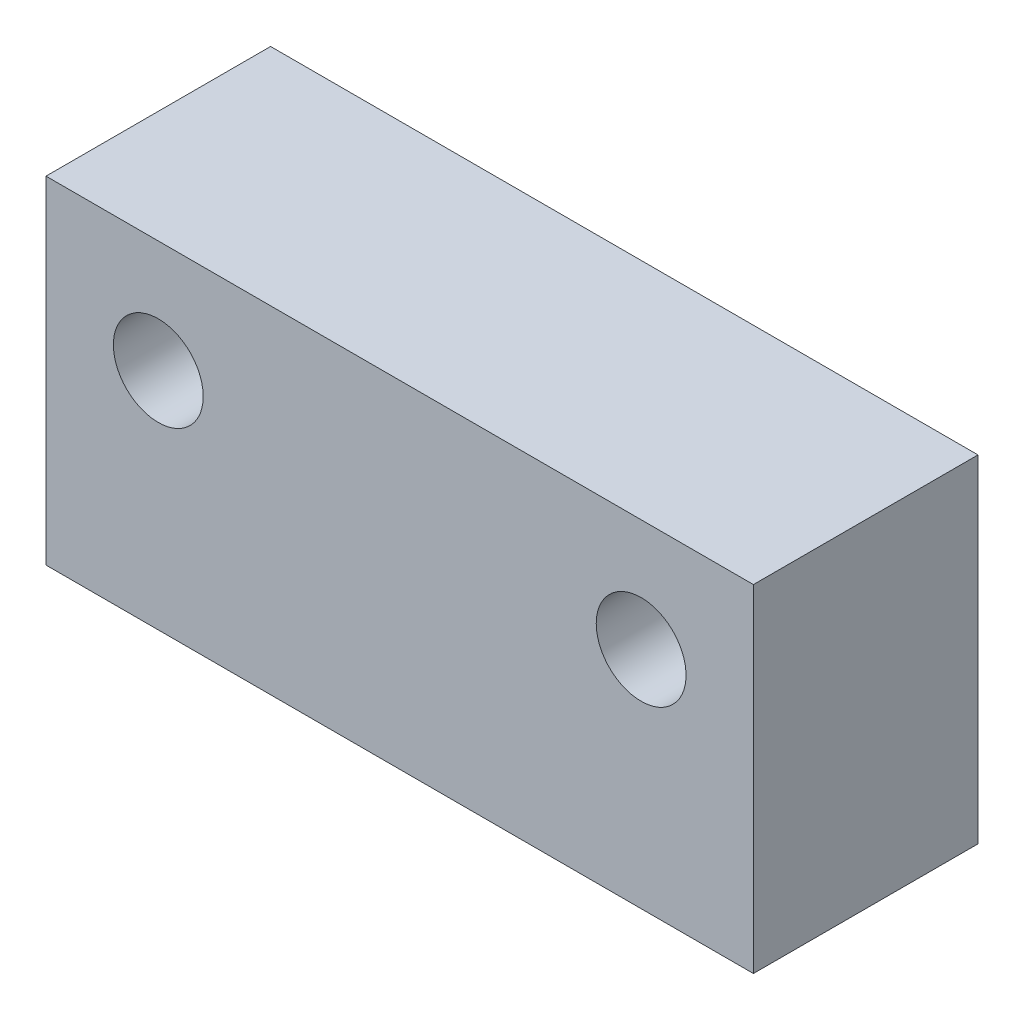
ISO-10303-21;
HEADER;
FILE_DESCRIPTION(('STEP AP214'),'2;1');
FILE_NAME('part.step','',(''),(''),'','','');
FILE_SCHEMA(('AUTOMOTIVE_DESIGN { 1 0 10303 214 1 1 1 1 }'));
ENDSEC;
DATA;
#1=APPLICATION_CONTEXT('core data for automotive mechanical design processes');
#2=APPLICATION_PROTOCOL_DEFINITION('international standard','automotive_design',2000,#1);
#3=PRODUCT_CONTEXT('',#1,'mechanical');
#4=PRODUCT('Part','Part','',(#3));
#5=PRODUCT_RELATED_PRODUCT_CATEGORY('part','',(#4));
#6=PRODUCT_DEFINITION_FORMATION('','',#4);
#7=PRODUCT_DEFINITION_CONTEXT('part definition',#1,'design');
#8=PRODUCT_DEFINITION('design','',#6,#7);
#9=PRODUCT_DEFINITION_SHAPE('','',#8);
#10=(LENGTH_UNIT() NAMED_UNIT(*) SI_UNIT(.MILLI.,.METRE.));
#11=(NAMED_UNIT(*) PLANE_ANGLE_UNIT() SI_UNIT($,.RADIAN.));
#12=(NAMED_UNIT(*) SI_UNIT($,.STERADIAN.) SOLID_ANGLE_UNIT());
#13=UNCERTAINTY_MEASURE_WITH_UNIT(LENGTH_MEASURE(1.E-05),#10,'distance_accuracy_value','');
#14=(GEOMETRIC_REPRESENTATION_CONTEXT(3) GLOBAL_UNCERTAINTY_ASSIGNED_CONTEXT((#13)) GLOBAL_UNIT_ASSIGNED_CONTEXT((#10,
#11,#12)) REPRESENTATION_CONTEXT('',''));
#15=CARTESIAN_POINT('',(0.,0.,0.));
#16=DIRECTION('',(0.,0.,1.));
#17=DIRECTION('',(1.,0.,0.));
#18=AXIS2_PLACEMENT_3D('',#15,#16,#17);
#19=CARTESIAN_POINT('',(0.,0.,20.));
#20=DIRECTION('',(0.,0.,-1.));
#21=DIRECTION('',(-1.,0.,0.));
#22=AXIS2_PLACEMENT_3D('',#19,#20,#21);
#23=PLANE('',#22);
#24=DIRECTION('',(0.,-1.,0.));
#25=VECTOR('',#24,1.);
#26=CARTESIAN_POINT('',(0.,0.,20.));
#27=LINE('',#26,#25);
#28=CARTESIAN_POINT('',(0.,30.,20.));
#29=VERTEX_POINT('',#28);
#30=CARTESIAN_POINT('',(0.,0.,20.));
#31=VERTEX_POINT('',#30);
#32=EDGE_CURVE('E86',#29,#31,#27,.T.);
#33=ORIENTED_EDGE('',*,*,#32,.T.);
#34=DIRECTION('',(1.,0.,0.));
#35=VECTOR('',#34,1.);
#36=CARTESIAN_POINT('',(0.,0.,20.));
#37=LINE('',#36,#35);
#38=CARTESIAN_POINT('',(63.,0.,20.));
#39=VERTEX_POINT('',#38);
#40=EDGE_CURVE('E81',#31,#39,#37,.T.);
#41=ORIENTED_EDGE('',*,*,#40,.T.);
#42=DIRECTION('',(0.,1.,0.));
#43=VECTOR('',#42,1.);
#44=CARTESIAN_POINT('',(63.,0.,20.));
#45=LINE('',#44,#43);
#46=CARTESIAN_POINT('',(63.,30.,20.));
#47=VERTEX_POINT('',#46);
#48=EDGE_CURVE('E84',#39,#47,#45,.T.);
#49=ORIENTED_EDGE('',*,*,#48,.T.);
#50=DIRECTION('',(-1.,0.,0.));
#51=VECTOR('',#50,1.);
#52=CARTESIAN_POINT('',(0.,30.,20.));
#53=LINE('',#52,#51);
#54=EDGE_CURVE('E51',#47,#29,#53,.T.);
#55=ORIENTED_EDGE('',*,*,#54,.T.);
#56=EDGE_LOOP('',(#33,#41,#49,#55));
#57=FACE_BOUND('',#56,.T.);
#58=CARTESIAN_POINT('',(10.,20.,20.));
#59=DIRECTION('',(0.,0.,1.));
#60=DIRECTION('',(1.,0.,0.));
#61=AXIS2_PLACEMENT_3D('',#58,#59,#60);
#62=CIRCLE('',#61,4.);
#63=CARTESIAN_POINT('',(14.,20.,20.));
#64=VERTEX_POINT('',#63);
#65=EDGE_CURVE('E101',#64,#64,#62,.T.);
#66=ORIENTED_EDGE('',*,*,#65,.F.);
#67=EDGE_LOOP('',(#66));
#68=FACE_BOUND('',#67,.T.);
#69=CARTESIAN_POINT('',(53.,20.,20.));
#70=DIRECTION('',(0.,0.,1.));
#71=DIRECTION('',(-1.,0.,0.));
#72=AXIS2_PLACEMENT_3D('',#69,#70,#71);
#73=CIRCLE('',#72,4.);
#74=CARTESIAN_POINT('',(49.,20.,20.));
#75=VERTEX_POINT('',#74);
#76=EDGE_CURVE('E116',#75,#75,#73,.T.);
#77=ORIENTED_EDGE('',*,*,#76,.F.);
#78=EDGE_LOOP('',(#77));
#79=FACE_BOUND('',#78,.T.);
#80=ADVANCED_FACE('F34',(#57,#68,#79),#23,.F.);
#81=CARTESIAN_POINT('',(0.,0.,0.));
#82=DIRECTION('',(0.,0.,-1.));
#83=DIRECTION('',(-1.,0.,0.));
#84=AXIS2_PLACEMENT_3D('',#81,#82,#83);
#85=PLANE('',#84);
#86=CARTESIAN_POINT('',(10.,20.,0.));
#87=DIRECTION('',(0.,0.,1.));
#88=DIRECTION('',(1.,0.,0.));
#89=AXIS2_PLACEMENT_3D('',#86,#87,#88);
#90=CIRCLE('',#89,4.);
#91=CARTESIAN_POINT('',(14.,20.,0.));
#92=VERTEX_POINT('',#91);
#93=EDGE_CURVE('E113',#92,#92,#90,.T.);
#94=ORIENTED_EDGE('',*,*,#93,.T.);
#95=EDGE_LOOP('',(#94));
#96=FACE_BOUND('',#95,.T.);
#97=DIRECTION('',(0.,-1.,0.));
#98=VECTOR('',#97,1.);
#99=CARTESIAN_POINT('',(0.,0.,0.));
#100=LINE('',#99,#98);
#101=CARTESIAN_POINT('',(0.,30.,0.));
#102=VERTEX_POINT('',#101);
#103=CARTESIAN_POINT('',(0.,0.,0.));
#104=VERTEX_POINT('',#103);
#105=EDGE_CURVE('E98',#102,#104,#100,.T.);
#106=ORIENTED_EDGE('',*,*,#105,.F.);
#107=DIRECTION('',(-1.,0.,0.));
#108=VECTOR('',#107,1.);
#109=CARTESIAN_POINT('',(0.,30.,0.));
#110=LINE('',#109,#108);
#111=CARTESIAN_POINT('',(63.,30.,0.));
#112=VERTEX_POINT('',#111);
#113=EDGE_CURVE('E74',#112,#102,#110,.T.);
#114=ORIENTED_EDGE('',*,*,#113,.F.);
#115=DIRECTION('',(0.,1.,0.));
#116=VECTOR('',#115,1.);
#117=CARTESIAN_POINT('',(63.,0.,0.));
#118=LINE('',#117,#116);
#119=CARTESIAN_POINT('',(63.,0.,0.));
#120=VERTEX_POINT('',#119);
#121=EDGE_CURVE('E68',#120,#112,#118,.T.);
#122=ORIENTED_EDGE('',*,*,#121,.F.);
#123=DIRECTION('',(1.,0.,0.));
#124=VECTOR('',#123,1.);
#125=CARTESIAN_POINT('',(0.,0.,0.));
#126=LINE('',#125,#124);
#127=EDGE_CURVE('E90',#104,#120,#126,.T.);
#128=ORIENTED_EDGE('',*,*,#127,.F.);
#129=EDGE_LOOP('',(#106,#114,#122,#128));
#130=FACE_BOUND('',#129,.T.);
#131=CARTESIAN_POINT('',(53.,20.,0.));
#132=DIRECTION('',(0.,0.,1.));
#133=DIRECTION('',(-1.,0.,0.));
#134=AXIS2_PLACEMENT_3D('',#131,#132,#133);
#135=CIRCLE('',#134,4.);
#136=CARTESIAN_POINT('',(49.,20.,0.));
#137=VERTEX_POINT('',#136);
#138=EDGE_CURVE('E119',#137,#137,#135,.T.);
#139=ORIENTED_EDGE('',*,*,#138,.T.);
#140=EDGE_LOOP('',(#139));
#141=FACE_BOUND('',#140,.T.);
#142=ADVANCED_FACE('F109',(#96,#130,#141),#85,.T.);
#143=CARTESIAN_POINT('',(0.,0.,20.));
#144=DIRECTION('',(1.,0.,0.));
#145=DIRECTION('',(0.,0.,-1.));
#146=AXIS2_PLACEMENT_3D('',#143,#144,#145);
#147=PLANE('',#146);
#148=ORIENTED_EDGE('',*,*,#105,.T.);
#149=DIRECTION('',(0.,0.,-1.));
#150=VECTOR('',#149,1.);
#151=CARTESIAN_POINT('',(0.,0.,20.));
#152=LINE('',#151,#150);
#153=EDGE_CURVE('E11',#31,#104,#152,.T.);
#154=ORIENTED_EDGE('',*,*,#153,.F.);
#155=ORIENTED_EDGE('',*,*,#32,.F.);
#156=DIRECTION('',(0.,0.,-1.));
#157=VECTOR('',#156,1.);
#158=CARTESIAN_POINT('',(0.,30.,20.));
#159=LINE('',#158,#157);
#160=EDGE_CURVE('E94',#29,#102,#159,.T.);
#161=ORIENTED_EDGE('',*,*,#160,.T.);
#162=EDGE_LOOP('',(#148,#154,#155,#161));
#163=FACE_BOUND('',#162,.T.);
#164=ADVANCED_FACE('F36',(#163),#147,.F.);
#165=CARTESIAN_POINT('',(0.,0.,20.));
#166=DIRECTION('',(0.,1.,0.));
#167=DIRECTION('',(-1.,0.,0.));
#168=AXIS2_PLACEMENT_3D('',#165,#166,#167);
#169=PLANE('',#168);
#170=ORIENTED_EDGE('',*,*,#127,.T.);
#171=DIRECTION('',(0.,0.,-1.));
#172=VECTOR('',#171,1.);
#173=CARTESIAN_POINT('',(63.,0.,20.));
#174=LINE('',#173,#172);
#175=EDGE_CURVE('E43',#39,#120,#174,.T.);
#176=ORIENTED_EDGE('',*,*,#175,.F.);
#177=ORIENTED_EDGE('',*,*,#40,.F.);
#178=ORIENTED_EDGE('',*,*,#153,.T.);
#179=EDGE_LOOP('',(#170,#176,#177,#178));
#180=FACE_BOUND('',#179,.T.);
#181=ADVANCED_FACE('F89',(#180),#169,.F.);
#182=CARTESIAN_POINT('',(63.,0.,20.));
#183=DIRECTION('',(-1.,0.,0.));
#184=DIRECTION('',(0.,-1.,0.));
#185=AXIS2_PLACEMENT_3D('',#182,#183,#184);
#186=PLANE('',#185);
#187=ORIENTED_EDGE('',*,*,#121,.T.);
#188=DIRECTION('',(0.,0.,-1.));
#189=VECTOR('',#188,1.);
#190=CARTESIAN_POINT('',(63.,30.,20.));
#191=LINE('',#190,#189);
#192=EDGE_CURVE('E91',#47,#112,#191,.T.);
#193=ORIENTED_EDGE('',*,*,#192,.F.);
#194=ORIENTED_EDGE('',*,*,#48,.F.);
#195=ORIENTED_EDGE('',*,*,#175,.T.);
#196=EDGE_LOOP('',(#187,#193,#194,#195));
#197=FACE_BOUND('',#196,.T.);
#198=ADVANCED_FACE('F92',(#197),#186,.F.);
#199=CARTESIAN_POINT('',(0.,30.,20.));
#200=DIRECTION('',(0.,-1.,0.));
#201=DIRECTION('',(1.,0.,0.));
#202=AXIS2_PLACEMENT_3D('',#199,#200,#201);
#203=PLANE('',#202);
#204=ORIENTED_EDGE('',*,*,#113,.T.);
#205=ORIENTED_EDGE('',*,*,#160,.F.);
#206=ORIENTED_EDGE('',*,*,#54,.F.);
#207=ORIENTED_EDGE('',*,*,#192,.T.);
#208=EDGE_LOOP('',(#204,#205,#206,#207));
#209=FACE_BOUND('',#208,.T.);
#210=ADVANCED_FACE('F106',(#209),#203,.F.);
#211=CARTESIAN_POINT('',(10.,20.,20.));
#212=DIRECTION('',(0.,0.,-1.));
#213=DIRECTION('',(-1.,0.,0.));
#214=AXIS2_PLACEMENT_3D('',#211,#212,#213);
#215=CYLINDRICAL_SURFACE('',#214,4.);
#216=ORIENTED_EDGE('',*,*,#65,.T.);
#217=EDGE_LOOP('',(#216));
#218=FACE_BOUND('',#217,.T.);
#219=ORIENTED_EDGE('',*,*,#93,.F.);
#220=EDGE_LOOP('',(#219));
#221=FACE_BOUND('',#220,.T.);
#222=ADVANCED_FACE('F136',(#218,#221),#215,.F.);
#223=CARTESIAN_POINT('',(53.,20.,20.));
#224=DIRECTION('',(0.,0.,-1.));
#225=DIRECTION('',(-1.,0.,0.));
#226=AXIS2_PLACEMENT_3D('',#223,#224,#225);
#227=CYLINDRICAL_SURFACE('',#226,4.);
#228=ORIENTED_EDGE('',*,*,#76,.T.);
#229=EDGE_LOOP('',(#228));
#230=FACE_BOUND('',#229,.T.);
#231=ORIENTED_EDGE('',*,*,#138,.F.);
#232=EDGE_LOOP('',(#231));
#233=FACE_BOUND('',#232,.T.);
#234=ADVANCED_FACE('F125',(#230,#233),#227,.F.);
#235=CLOSED_SHELL('',(#80,#142,#164,#181,#198,#210,#222,#234));
#236=MANIFOLD_SOLID_BREP('B2',#235);
#237=ADVANCED_BREP_SHAPE_REPRESENTATION('',(#18,#236),#14);
#238=SHAPE_DEFINITION_REPRESENTATION(#9,#237);
ENDSEC;
END-ISO-10303-21;
